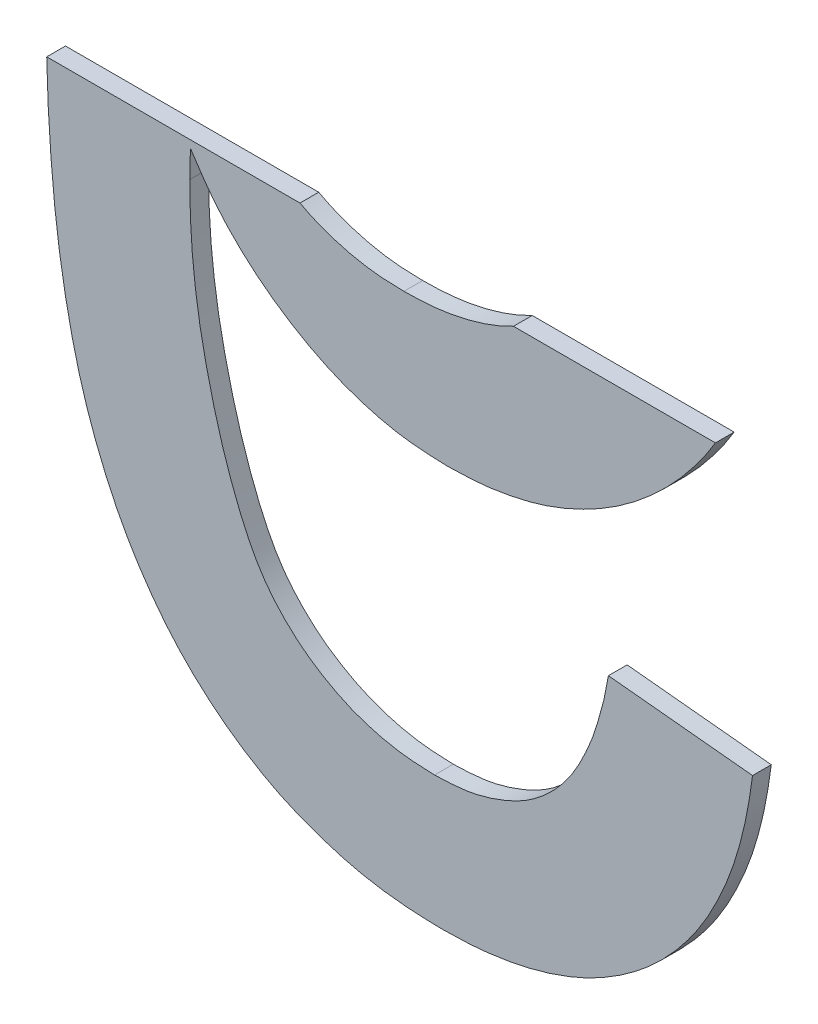
ISO-10303-21;
HEADER;
FILE_DESCRIPTION(('STEP AP214'),'2;1');
FILE_NAME('part.step','',(''),(''),'','','');
FILE_SCHEMA(('AUTOMOTIVE_DESIGN { 1 0 10303 214 1 1 1 1 }'));
ENDSEC;
DATA;
#1=APPLICATION_CONTEXT('core data for automotive mechanical design processes');
#2=APPLICATION_PROTOCOL_DEFINITION('international standard','automotive_design',2000,#1);
#3=PRODUCT_CONTEXT('',#1,'mechanical');
#4=PRODUCT('Part','Part','',(#3));
#5=PRODUCT_RELATED_PRODUCT_CATEGORY('part','',(#4));
#6=PRODUCT_DEFINITION_FORMATION('','',#4);
#7=PRODUCT_DEFINITION_CONTEXT('part definition',#1,'design');
#8=PRODUCT_DEFINITION('design','',#6,#7);
#9=PRODUCT_DEFINITION_SHAPE('','',#8);
#10=(LENGTH_UNIT() NAMED_UNIT(*) SI_UNIT(.MILLI.,.METRE.));
#11=(NAMED_UNIT(*) PLANE_ANGLE_UNIT() SI_UNIT($,.RADIAN.));
#12=(NAMED_UNIT(*) SI_UNIT($,.STERADIAN.) SOLID_ANGLE_UNIT());
#13=UNCERTAINTY_MEASURE_WITH_UNIT(LENGTH_MEASURE(1.E-05),#10,'distance_accuracy_value','');
#14=(GEOMETRIC_REPRESENTATION_CONTEXT(3) GLOBAL_UNCERTAINTY_ASSIGNED_CONTEXT((#13)) GLOBAL_UNIT_ASSIGNED_CONTEXT((#10,
#11,#12)) REPRESENTATION_CONTEXT('',''));
#15=CARTESIAN_POINT('',(0.,0.,0.));
#16=DIRECTION('',(0.,0.,1.));
#17=DIRECTION('',(1.,0.,0.));
#18=AXIS2_PLACEMENT_3D('',#15,#16,#17);
#19=CARTESIAN_POINT('',(-5.76923076923075,-0.697115384615386,0.5));
#20=CARTESIAN_POINT('',(-5.58381379302698,-0.978684532166005,0.5));
#21=CARTESIAN_POINT('',(-5.21327861184885,-1.54136912145183,0.5));
#22=CARTESIAN_POINT('',(-4.53066128737662,-2.2965599472643,0.5));
#23=CARTESIAN_POINT('',(-3.7497350785045,-2.96642446712882,0.5));
#24=CARTESIAN_POINT('',(-2.88235389720051,-3.54576110995613,0.5));
#25=CARTESIAN_POINT('',(-1.94993542457347,-4.02121118676336,0.5));
#26=CARTESIAN_POINT('',(-0.968700834074324,-4.36669246782933,0.5));
#27=CARTESIAN_POINT('',(0.0528912759195013,-4.58002261946033,0.5));
#28=CARTESIAN_POINT('',(0.748170492673242,-4.60350834340691,0.5));
#29=CARTESIAN_POINT('',(1.09975961538463,-4.61538461538462,0.5));
#30=B_SPLINE_CURVE_WITH_KNOTS('',3,(#19,#20,#21,#22,#23,#24,#25,#26,#27,#28,#29),.UNSPECIFIED.,
.F.,.F.,(4,1,1,1,1,1,1,1,4),(0.,0.12235507096646,0.244512985363297,0.368378430893787,
0.495352609667666,0.622624745145016,0.747620530593695,0.872376630710713,1.),.UNSPECIFIED.);
#31=DIRECTION('',(0.,0.,-1.));
#32=VECTOR('',#31,1.);
#33=SURFACE_OF_LINEAR_EXTRUSION('',#30,#32);
#34=CARTESIAN_POINT('',(-5.76923076923075,-0.697115384615386,0.));
#35=CARTESIAN_POINT('',(-5.58381379302698,-0.978684532166005,0.));
#36=CARTESIAN_POINT('',(-5.21327861184885,-1.54136912145183,0.));
#37=CARTESIAN_POINT('',(-4.53066128737662,-2.2965599472643,0.));
#38=CARTESIAN_POINT('',(-3.7497350785045,-2.96642446712882,0.));
#39=CARTESIAN_POINT('',(-2.88235389720051,-3.54576110995613,0.));
#40=CARTESIAN_POINT('',(-1.94993542457347,-4.02121118676336,0.));
#41=CARTESIAN_POINT('',(-0.968700834074324,-4.36669246782933,0.));
#42=CARTESIAN_POINT('',(0.0528912759195013,-4.58002261946033,0.));
#43=CARTESIAN_POINT('',(0.748170492673242,-4.60350834340691,0.));
#44=CARTESIAN_POINT('',(1.09975961538463,-4.61538461538462,0.));
#45=B_SPLINE_CURVE_WITH_KNOTS('',3,(#34,#35,#36,#37,#38,#39,#40,#41,#42,#43,#44),.UNSPECIFIED.,
.F.,.F.,(4,1,1,1,1,1,1,1,4),(0.,0.12235507096646,0.244512985363297,0.368378430893787,
0.495352609667666,0.622624745145016,0.747620530593695,0.872376630710713,1.),.UNSPECIFIED.);
#46=CARTESIAN_POINT('',(-5.76923076923075,-0.697115384615386,0.));
#47=VERTEX_POINT('',#46);
#48=CARTESIAN_POINT('',(1.09975961538463,-4.61538461538462,0.));
#49=VERTEX_POINT('',#48);
#50=EDGE_CURVE('E133',#47,#49,#45,.T.);
#51=ORIENTED_EDGE('',*,*,#50,.T.);
#52=DIRECTION('',(0.,0.,-1.));
#53=VECTOR('',#52,1.);
#54=CARTESIAN_POINT('',(1.09975961538463,-4.61538461538462,0.5));
#55=LINE('',#54,#53);
#56=CARTESIAN_POINT('',(1.09975961538463,-4.61538461538462,0.5));
#57=VERTEX_POINT('',#56);
#58=EDGE_CURVE('E160',#57,#49,#55,.T.);
#59=ORIENTED_EDGE('',*,*,#58,.F.);
#60=CARTESIAN_POINT('',(-5.76923076923075,-0.697115384615386,0.5));
#61=VERTEX_POINT('',#60);
#62=EDGE_CURVE('E285',#61,#57,#30,.T.);
#63=ORIENTED_EDGE('',*,*,#62,.F.);
#64=DIRECTION('',(0.,0.,-1.));
#65=VECTOR('',#64,1.);
#66=CARTESIAN_POINT('',(-5.76923076923075,-0.697115384615386,0.5));
#67=LINE('',#66,#65);
#68=EDGE_CURVE('E575',#61,#47,#67,.T.);
#69=ORIENTED_EDGE('',*,*,#68,.T.);
#70=EDGE_LOOP('',(#51,#59,#63,#69));
#71=FACE_BOUND('',#70,.T.);
#72=ADVANCED_FACE('F39',(#71),#33,.F.);
#73=CARTESIAN_POINT('',(-5.7872596153846,-1.43028846153846,0.5));
#74=CARTESIAN_POINT('',(-5.78543907945261,-1.32812063639986,0.5));
#75=CARTESIAN_POINT('',(-5.78108355384899,-1.08369009787678,0.5));
#76=CARTESIAN_POINT('',(-5.77359135554209,-0.839334488163484,0.5));
#77=CARTESIAN_POINT('',(-5.76923076923075,-0.697115384615386,0.5));
#78=B_SPLINE_CURVE_WITH_KNOTS('',3,(#73,#74,#75,#76,#77),.UNSPECIFIED.,.F.,.F.,(4,1,4),(0.,
0.417983062819945,1.),.UNSPECIFIED.);
#79=DIRECTION('',(0.,0.,-1.));
#80=VECTOR('',#79,1.);
#81=SURFACE_OF_LINEAR_EXTRUSION('',#78,#80);
#82=CARTESIAN_POINT('',(-5.7872596153846,-1.43028846153846,0.));
#83=CARTESIAN_POINT('',(-5.78543907945261,-1.32812063639986,0.));
#84=CARTESIAN_POINT('',(-5.78108355384899,-1.08369009787678,0.));
#85=CARTESIAN_POINT('',(-5.77359135554209,-0.839334488163484,0.));
#86=CARTESIAN_POINT('',(-5.76923076923075,-0.697115384615386,0.));
#87=B_SPLINE_CURVE_WITH_KNOTS('',3,(#82,#83,#84,#85,#86),.UNSPECIFIED.,.F.,.F.,(4,1,4),(0.,
0.417983062819945,1.),.UNSPECIFIED.);
#88=CARTESIAN_POINT('',(-5.7872596153846,-1.43028846153846,0.));
#89=VERTEX_POINT('',#88);
#90=EDGE_CURVE('E195',#89,#47,#87,.T.);
#91=ORIENTED_EDGE('',*,*,#90,.T.);
#92=ORIENTED_EDGE('',*,*,#68,.F.);
#93=CARTESIAN_POINT('',(-5.7872596153846,-1.43028846153846,0.5));
#94=VERTEX_POINT('',#93);
#95=EDGE_CURVE('E288',#94,#61,#78,.T.);
#96=ORIENTED_EDGE('',*,*,#95,.F.);
#97=DIRECTION('',(0.,0.,-1.));
#98=VECTOR('',#97,1.);
#99=CARTESIAN_POINT('',(-5.7872596153846,-1.43028846153846,0.5));
#100=LINE('',#99,#98);
#101=EDGE_CURVE('E578',#94,#89,#100,.T.);
#102=ORIENTED_EDGE('',*,*,#101,.T.);
#103=EDGE_LOOP('',(#91,#92,#96,#102));
#104=FACE_BOUND('',#103,.T.);
#105=ADVANCED_FACE('F308',(#104),#81,.F.);
#106=CARTESIAN_POINT('',(0.745192307692323,-11.9230769230769,0.5));
#107=CARTESIAN_POINT('',(0.486131843449952,-11.9137479208925,0.5));
#108=CARTESIAN_POINT('',(-0.023739311296695,-11.8953869983553,0.5));
#109=CARTESIAN_POINT('',(-0.767148335472325,-11.7530516571858,0.5));
#110=CARTESIAN_POINT('',(-1.47411876752795,-11.5250334138168,0.5));
#111=CARTESIAN_POINT('',(-2.13234421598042,-11.1978749877077,0.5));
#112=CARTESIAN_POINT('',(-2.73942907415517,-10.7997323127317,0.5));
#113=CARTESIAN_POINT('',(-3.26969723061817,-10.3266586152699,0.5));
#114=CARTESIAN_POINT('',(-3.73022940699366,-9.79902859292467,0.5));
#115=CARTESIAN_POINT('',(-4.10846938257053,-9.19109757118498,0.5));
#116=CARTESIAN_POINT('',(-4.43130742011076,-8.4967383071236,0.5));
#117=CARTESIAN_POINT('',(-4.73634641888079,-7.70711998570168,0.5));
#118=CARTESIAN_POINT('',(-5.02490826013239,-6.80863885863995,0.5));
#119=CARTESIAN_POINT('',(-5.28136505449538,-5.81275474275421,0.5));
#120=CARTESIAN_POINT('',(-5.51100955926097,-4.75582556366904,0.5));
#121=CARTESIAN_POINT('',(-5.67217185368737,-3.66180020661924,0.5));
#122=CARTESIAN_POINT('',(-5.77132873386463,-2.5519482184744,0.5));
#123=CARTESIAN_POINT('',(-5.7819362671156,-1.8050941819883,0.5));
#124=CARTESIAN_POINT('',(-5.7872596153846,-1.43028846153846,0.5));
#125=B_SPLINE_CURVE_WITH_KNOTS('',3,(#106,#107,#108,#109,#110,#111,#112,#113,#114,#115,#116,
#117,#118,#119,#120,#121,#122,#123,#124),.UNSPECIFIED.,.F.,.F.,(4,1,1,1,1,1,1,1,1,1,1,1,1,1,1,1,
4),(0.,0.0561121469696214,0.110437404080105,0.163431413703198,0.216631308793094,
0.269250545502901,0.320302612616842,0.370170605167896,0.420516318229052,0.474888393265587,
0.535919197587643,0.603880391457304,0.679276566607707,0.758720144956108,0.838169654364157,
0.918786086271869,1.),.UNSPECIFIED.);
#126=DIRECTION('',(0.,0.,-1.));
#127=VECTOR('',#126,1.);
#128=SURFACE_OF_LINEAR_EXTRUSION('',#125,#127);
#129=CARTESIAN_POINT('',(0.745192307692323,-11.9230769230769,0.));
#130=CARTESIAN_POINT('',(0.486131843449952,-11.9137479208925,0.));
#131=CARTESIAN_POINT('',(-0.023739311296695,-11.8953869983553,0.));
#132=CARTESIAN_POINT('',(-0.767148335472325,-11.7530516571858,0.));
#133=CARTESIAN_POINT('',(-1.47411876752795,-11.5250334138168,0.));
#134=CARTESIAN_POINT('',(-2.13234421598042,-11.1978749877077,0.));
#135=CARTESIAN_POINT('',(-2.73942907415517,-10.7997323127317,0.));
#136=CARTESIAN_POINT('',(-3.26969723061817,-10.3266586152699,0.));
#137=CARTESIAN_POINT('',(-3.73022940699366,-9.79902859292467,0.));
#138=CARTESIAN_POINT('',(-4.10846938257053,-9.19109757118498,0.));
#139=CARTESIAN_POINT('',(-4.43130742011076,-8.4967383071236,0.));
#140=CARTESIAN_POINT('',(-4.73634641888079,-7.70711998570168,0.));
#141=CARTESIAN_POINT('',(-5.02490826013239,-6.80863885863995,0.));
#142=CARTESIAN_POINT('',(-5.28136505449538,-5.81275474275421,0.));
#143=CARTESIAN_POINT('',(-5.51100955926097,-4.75582556366904,0.));
#144=CARTESIAN_POINT('',(-5.67217185368737,-3.66180020661924,0.));
#145=CARTESIAN_POINT('',(-5.77132873386463,-2.5519482184744,0.));
#146=CARTESIAN_POINT('',(-5.7819362671156,-1.8050941819883,0.));
#147=CARTESIAN_POINT('',(-5.7872596153846,-1.43028846153846,0.));
#148=B_SPLINE_CURVE_WITH_KNOTS('',3,(#129,#130,#131,#132,#133,#134,#135,#136,#137,#138,#139,
#140,#141,#142,#143,#144,#145,#146,#147),.UNSPECIFIED.,.F.,.F.,(4,1,1,1,1,1,1,1,1,1,1,1,1,1,1,1,
4),(0.,0.0561121469696214,0.110437404080105,0.163431413703198,0.216631308793094,
0.269250545502901,0.320302612616842,0.370170605167896,0.420516318229052,0.474888393265587,
0.535919197587643,0.603880391457304,0.679276566607707,0.758720144956108,0.838169654364157,
0.918786086271869,1.),.UNSPECIFIED.);
#149=CARTESIAN_POINT('',(0.745192307692324,-11.9230769230769,0.));
#150=VERTEX_POINT('',#149);
#151=EDGE_CURVE('E184',#150,#89,#148,.T.);
#152=ORIENTED_EDGE('',*,*,#151,.T.);
#153=ORIENTED_EDGE('',*,*,#101,.F.);
#154=CARTESIAN_POINT('',(0.745192307692324,-11.9230769230769,0.5));
#155=VERTEX_POINT('',#154);
#156=EDGE_CURVE('E300',#155,#94,#125,.T.);
#157=ORIENTED_EDGE('',*,*,#156,.F.);
#158=DIRECTION('',(0.,0.,-1.));
#159=VECTOR('',#158,1.);
#160=CARTESIAN_POINT('',(0.745192307692324,-11.9230769230769,0.5));
#161=LINE('',#160,#159);
#162=EDGE_CURVE('E576',#155,#150,#161,.T.);
#163=ORIENTED_EDGE('',*,*,#162,.T.);
#164=EDGE_LOOP('',(#152,#153,#157,#163));
#165=FACE_BOUND('',#164,.T.);
#166=ADVANCED_FACE('F309',(#165),#128,.F.);
#167=CARTESIAN_POINT('',(5.3846153846154,-7.30769230769231,0.5));
#168=CARTESIAN_POINT('',(5.34984385892072,-7.50475409295837,0.5));
#169=CARTESIAN_POINT('',(5.28262755072809,-7.88569123698083,0.5));
#170=CARTESIAN_POINT('',(5.13094152747863,-8.42859194661917,0.5));
#171=CARTESIAN_POINT('',(4.97709469121427,-8.93479428414117,0.5));
#172=CARTESIAN_POINT('',(4.77849915191939,-9.39302127303128,0.5));
#173=CARTESIAN_POINT('',(4.57167637521298,-9.81571962134782,0.5));
#174=CARTESIAN_POINT('',(4.3374552557641,-10.1986535679597,0.5));
#175=CARTESIAN_POINT('',(4.07166276021052,-10.5341320041231,0.5));
#176=CARTESIAN_POINT('',(3.69632885357006,-10.9272529401627,0.5));
#177=CARTESIAN_POINT('',(3.16378468823838,-11.3374813077678,0.5));
#178=CARTESIAN_POINT('',(2.42560630063418,-11.6697822763518,0.5));
#179=CARTESIAN_POINT('',(1.61354073541334,-11.8932116708321,0.5));
#180=CARTESIAN_POINT('',(1.04125812096131,-11.9128942822014,0.5));
#181=CARTESIAN_POINT('',(0.745192307692324,-11.9230769230769,0.5));
#182=B_SPLINE_CURVE_WITH_KNOTS('',3,(#167,#168,#169,#170,#171,#172,#173,#174,#175,#176,#177,
#178,#179,#180,#181),.UNSPECIFIED.,.F.,.F.,(4,1,1,1,1,1,1,1,1,1,1,1,4),(0.,0.0828763755690714,
0.16020706284372,0.233459386692897,0.301920909441199,0.366895738384487,0.42841034775951,
0.487536786371614,0.543906075892287,0.65349798480259,0.763438398464128,0.877616755815664,1.),.UNSPECIFIED.);
#183=DIRECTION('',(0.,0.,-1.));
#184=VECTOR('',#183,1.);
#185=SURFACE_OF_LINEAR_EXTRUSION('',#182,#184);
#186=CARTESIAN_POINT('',(5.3846153846154,-7.30769230769231,0.));
#187=CARTESIAN_POINT('',(5.34984385892072,-7.50475409295837,0.));
#188=CARTESIAN_POINT('',(5.28262755072809,-7.88569123698083,0.));
#189=CARTESIAN_POINT('',(5.13094152747863,-8.42859194661917,0.));
#190=CARTESIAN_POINT('',(4.97709469121427,-8.93479428414117,0.));
#191=CARTESIAN_POINT('',(4.77849915191939,-9.39302127303128,0.));
#192=CARTESIAN_POINT('',(4.57167637521298,-9.81571962134782,0.));
#193=CARTESIAN_POINT('',(4.3374552557641,-10.1986535679597,0.));
#194=CARTESIAN_POINT('',(4.07166276021052,-10.5341320041231,0.));
#195=CARTESIAN_POINT('',(3.69632885357006,-10.9272529401627,0.));
#196=CARTESIAN_POINT('',(3.16378468823838,-11.3374813077678,0.));
#197=CARTESIAN_POINT('',(2.42560630063418,-11.6697822763518,0.));
#198=CARTESIAN_POINT('',(1.61354073541334,-11.8932116708321,0.));
#199=CARTESIAN_POINT('',(1.04125812096131,-11.9128942822014,0.));
#200=CARTESIAN_POINT('',(0.745192307692324,-11.9230769230769,0.));
#201=B_SPLINE_CURVE_WITH_KNOTS('',3,(#186,#187,#188,#189,#190,#191,#192,#193,#194,#195,#196,
#197,#198,#199,#200),.UNSPECIFIED.,.F.,.F.,(4,1,1,1,1,1,1,1,1,1,1,1,4),(0.,0.0828763755690714,
0.16020706284372,0.233459386692897,0.301920909441199,0.366895738384487,0.42841034775951,
0.487536786371614,0.543906075892287,0.65349798480259,0.763438398464128,0.877616755815664,1.),.UNSPECIFIED.);
#202=CARTESIAN_POINT('',(5.3846153846154,-7.30769230769231,0.));
#203=VERTEX_POINT('',#202);
#204=EDGE_CURVE('E168',#203,#150,#201,.T.);
#205=ORIENTED_EDGE('',*,*,#204,.T.);
#206=ORIENTED_EDGE('',*,*,#162,.F.);
#207=CARTESIAN_POINT('',(5.3846153846154,-7.30769230769231,0.5));
#208=VERTEX_POINT('',#207);
#209=EDGE_CURVE('E318',#208,#155,#182,.T.);
#210=ORIENTED_EDGE('',*,*,#209,.F.);
#211=DIRECTION('',(0.,0.,-1.));
#212=VECTOR('',#211,1.);
#213=CARTESIAN_POINT('',(5.3846153846154,-7.30769230769231,0.5));
#214=LINE('',#213,#212);
#215=EDGE_CURVE('E582',#208,#203,#214,.T.);
#216=ORIENTED_EDGE('',*,*,#215,.T.);
#217=EDGE_LOOP('',(#205,#206,#210,#216));
#218=FACE_BOUND('',#217,.T.);
#219=ADVANCED_FACE('F313',(#218),#185,.F.);
#220=CARTESIAN_POINT('',(9.23076923076925,-7.69230769230769,0.5));
#221=DIRECTION('',(-0.099503719020999,-0.995037190209989,0.));
#222=DIRECTION('',(0.995037190209989,-0.0995037190209991,0.));
#223=AXIS2_PLACEMENT_3D('',#220,#221,#222);
#224=PLANE('',#223);
#225=DIRECTION('',(-0.995037190209989,0.099503719020999,0.));
#226=VECTOR('',#225,1.);
#227=CARTESIAN_POINT('',(9.23076923076925,-7.69230769230769,0.));
#228=LINE('',#227,#226);
#229=CARTESIAN_POINT('',(9.23076923076925,-7.69230769230769,0.));
#230=VERTEX_POINT('',#229);
#231=EDGE_CURVE('E164',#230,#203,#228,.T.);
#232=ORIENTED_EDGE('',*,*,#231,.T.);
#233=ORIENTED_EDGE('',*,*,#215,.F.);
#234=DIRECTION('',(-0.995037190209989,0.099503719020999,0.));
#235=VECTOR('',#234,1.);
#236=CARTESIAN_POINT('',(9.23076923076925,-7.69230769230769,0.5));
#237=LINE('',#236,#235);
#238=CARTESIAN_POINT('',(9.23076923076925,-7.69230769230769,0.5));
#239=VERTEX_POINT('',#238);
#240=EDGE_CURVE('E322',#239,#208,#237,.T.);
#241=ORIENTED_EDGE('',*,*,#240,.F.);
#242=DIRECTION('',(0.,0.,-1.));
#243=VECTOR('',#242,1.);
#244=CARTESIAN_POINT('',(9.23076923076925,-7.69230769230769,0.5));
#245=LINE('',#244,#243);
#246=EDGE_CURVE('E49',#239,#230,#245,.T.);
#247=ORIENTED_EDGE('',*,*,#246,.T.);
#248=EDGE_LOOP('',(#232,#233,#241,#247));
#249=FACE_BOUND('',#248,.T.);
#250=ADVANCED_FACE('F316',(#249),#224,.F.);
#251=CARTESIAN_POINT('',(0.943509615384633,-15.3846153846154,0.5));
#252=CARTESIAN_POINT('',(1.22628026497043,-15.3797262561442,0.5));
#253=CARTESIAN_POINT('',(1.77952219090649,-15.3701606564064,0.5));
#254=CARTESIAN_POINT('',(2.58719848692074,-15.2695777028622,0.5));
#255=CARTESIAN_POINT('',(3.35661737490023,-15.1166588313252,0.5));
#256=CARTESIAN_POINT('',(4.08553958863802,-14.8909143623273,0.5));
#257=CARTESIAN_POINT('',(4.77942406383352,-14.6130289830505,0.5));
#258=CARTESIAN_POINT('',(5.42642753427259,-14.2579072723362,0.5));
#259=CARTESIAN_POINT('',(6.03804809271238,-13.848203062894,0.5));
#260=CARTESIAN_POINT('',(6.60674021401743,-13.3756543228348,0.5));
#261=CARTESIAN_POINT('',(7.12584529819792,-12.841996372828,0.5));
#262=CARTESIAN_POINT('',(7.59553619193628,-12.2603814173487,0.5));
#263=CARTESIAN_POINT('',(8.00731672421825,-11.6232765490402,0.5));
#264=CARTESIAN_POINT('',(8.35903190597762,-10.9344379490729,0.5));
#265=CARTESIAN_POINT('',(8.67056996655947,-10.1996608491813,0.5));
#266=CARTESIAN_POINT('',(8.91209668696316,-9.40909234193086,0.5));
#267=CARTESIAN_POINT('',(9.10831391588154,-8.57002381485291,0.5));
#268=CARTESIAN_POINT('',(9.1892916439912,-7.98960427492436,0.5));
#269=CARTESIAN_POINT('',(9.23076923076925,-7.69230769230769,0.5));
#270=B_SPLINE_CURVE_WITH_KNOTS('',3,(#251,#252,#253,#254,#255,#256,#257,#258,#259,#260,#261,
#262,#263,#264,#265,#266,#267,#268,#269),.UNSPECIFIED.,.F.,.F.,(4,1,1,1,1,1,1,1,1,1,1,1,1,1,1,1,
4),(0.,0.0676247856478378,0.132308168148376,0.194442718532601,0.255089752738009,
0.314635829043243,0.372971663301315,0.4313311216833,0.490552229969122,0.549528437155075,
0.609188219154995,0.669147607919159,0.730672799187913,0.794051994363794,0.859844647711371,
0.928211053549348,1.),.UNSPECIFIED.);
#271=DIRECTION('',(0.,0.,-1.));
#272=VECTOR('',#271,1.);
#273=SURFACE_OF_LINEAR_EXTRUSION('',#270,#272);
#274=CARTESIAN_POINT('',(0.943509615384633,-15.3846153846154,0.));
#275=CARTESIAN_POINT('',(1.22628026497043,-15.3797262561442,0.));
#276=CARTESIAN_POINT('',(1.77952219090649,-15.3701606564064,0.));
#277=CARTESIAN_POINT('',(2.58719848692074,-15.2695777028622,0.));
#278=CARTESIAN_POINT('',(3.35661737490023,-15.1166588313252,0.));
#279=CARTESIAN_POINT('',(4.08553958863802,-14.8909143623273,0.));
#280=CARTESIAN_POINT('',(4.77942406383352,-14.6130289830505,0.));
#281=CARTESIAN_POINT('',(5.42642753427259,-14.2579072723362,0.));
#282=CARTESIAN_POINT('',(6.03804809271238,-13.848203062894,0.));
#283=CARTESIAN_POINT('',(6.60674021401743,-13.3756543228348,0.));
#284=CARTESIAN_POINT('',(7.12584529819792,-12.841996372828,0.));
#285=CARTESIAN_POINT('',(7.59553619193628,-12.2603814173487,0.));
#286=CARTESIAN_POINT('',(8.00731672421825,-11.6232765490402,0.));
#287=CARTESIAN_POINT('',(8.35903190597762,-10.9344379490729,0.));
#288=CARTESIAN_POINT('',(8.67056996655947,-10.1996608491813,0.));
#289=CARTESIAN_POINT('',(8.91209668696316,-9.40909234193086,0.));
#290=CARTESIAN_POINT('',(9.10831391588154,-8.57002381485291,0.));
#291=CARTESIAN_POINT('',(9.1892916439912,-7.98960427492436,0.));
#292=CARTESIAN_POINT('',(9.23076923076925,-7.69230769230769,0.));
#293=B_SPLINE_CURVE_WITH_KNOTS('',3,(#274,#275,#276,#277,#278,#279,#280,#281,#282,#283,#284,
#285,#286,#287,#288,#289,#290,#291,#292),.UNSPECIFIED.,.F.,.F.,(4,1,1,1,1,1,1,1,1,1,1,1,1,1,1,1,
4),(0.,0.0676247856478378,0.132308168148376,0.194442718532601,0.255089752738009,
0.314635829043243,0.372971663301315,0.4313311216833,0.490552229969122,0.549528437155075,
0.609188219154995,0.669147607919159,0.730672799187913,0.794051994363794,0.859844647711371,
0.928211053549348,1.),.UNSPECIFIED.);
#294=CARTESIAN_POINT('',(0.943509615384633,-15.3846153846154,0.));
#295=VERTEX_POINT('',#294);
#296=EDGE_CURVE('E153',#295,#230,#293,.T.);
#297=ORIENTED_EDGE('',*,*,#296,.T.);
#298=ORIENTED_EDGE('',*,*,#246,.F.);
#299=CARTESIAN_POINT('',(0.943509615384633,-15.3846153846154,0.5));
#300=VERTEX_POINT('',#299);
#301=EDGE_CURVE('E146',#300,#239,#270,.T.);
#302=ORIENTED_EDGE('',*,*,#301,.F.);
#303=DIRECTION('',(0.,0.,-1.));
#304=VECTOR('',#303,1.);
#305=CARTESIAN_POINT('',(0.943509615384633,-15.3846153846154,0.5));
#306=LINE('',#305,#304);
#307=EDGE_CURVE('E143',#300,#295,#306,.T.);
#308=ORIENTED_EDGE('',*,*,#307,.T.);
#309=EDGE_LOOP('',(#297,#298,#302,#308));
#310=FACE_BOUND('',#309,.T.);
#311=ADVANCED_FACE('F41',(#310),#273,.F.);
#312=CARTESIAN_POINT('',(5.76923076923079,4.83774038461538,0.5));
#313=CARTESIAN_POINT('',(5.76559753253748,4.62107828632409,0.5));
#314=CARTESIAN_POINT('',(5.75847416780461,4.19628813908102,0.5));
#315=CARTESIAN_POINT('',(5.67364275234917,3.57634561138139,0.5));
#316=CARTESIAN_POINT('',(5.56049023234097,2.98466710580137,0.5));
#317=CARTESIAN_POINT('',(5.38010372830871,2.42729215161989,0.5));
#318=CARTESIAN_POINT('',(5.16279039895238,1.8961287409815,0.5));
#319=CARTESIAN_POINT('',(4.88034990033308,1.40337584742006,0.5));
#320=CARTESIAN_POINT('',(4.56234879705193,0.934299189069977,0.5));
#321=CARTESIAN_POINT('',(4.18974893379179,0.504612898451396,0.5));
#322=CARTESIAN_POINT('',(3.77783898339826,0.114812101552504,0.5));
#323=CARTESIAN_POINT('',(3.32794970507642,-0.224941250153386,0.5));
#324=CARTESIAN_POINT('',(2.845763670524,-0.515776018395924,0.5));
#325=CARTESIAN_POINT('',(2.32680117156969,-0.749856785619088,0.5));
#326=CARTESIAN_POINT('',(1.77417436897692,-0.930133405348942,0.5));
#327=CARTESIAN_POINT('',(1.18911678898298,-1.06285336343452,0.5));
#328=CARTESIAN_POINT('',(0.569085331114844,-1.14190466031389,0.5));
#329=CARTESIAN_POINT('',(0.144461754934995,-1.14981269841211,0.5));
#330=CARTESIAN_POINT('',(-0.0721153846153684,-1.15384615384615,0.5));
#331=B_SPLINE_CURVE_WITH_KNOTS('',3,(#312,#313,#314,#315,#316,#317,#318,#319,#320,#321,#322,
#323,#324,#325,#326,#327,#328,#329,#330),.UNSPECIFIED.,.F.,.F.,(4,1,1,1,1,1,1,1,1,1,1,1,1,1,1,1,
4),(0.,0.0688877507567127,0.135062099084096,0.198816097167165,0.260302455571233,
0.321151150591035,0.381081487065822,0.440665068442198,0.501229320566076,0.561652530159204,
0.620804960677879,0.680272507705816,0.740463287087672,0.801538582632135,0.864937900915904,
0.931112249243287,1.),.UNSPECIFIED.);
#332=DIRECTION('',(0.,0.,-1.));
#333=VECTOR('',#332,1.);
#334=SURFACE_OF_LINEAR_EXTRUSION('',#331,#333);
#335=CARTESIAN_POINT('',(2.85167830923094,-0.5,0.5));
#336=VERTEX_POINT('',#335);
#337=CARTESIAN_POINT('',(-0.0721153846153684,-1.15384615384615,0.5));
#338=VERTEX_POINT('',#337);
#339=EDGE_CURVE('E170',#336,#338,#331,.T.);
#340=ORIENTED_EDGE('',*,*,#339,.F.);
#341=DIRECTION('',(0.,0.,-1.));
#342=VECTOR('',#341,1.);
#343=CARTESIAN_POINT('',(2.85167830923094,-0.5,0.5));
#344=LINE('',#343,#342);
#345=CARTESIAN_POINT('',(2.85167830923094,-0.5,0.));
#346=VERTEX_POINT('',#345);
#347=EDGE_CURVE('E11',#336,#346,#344,.T.);
#348=ORIENTED_EDGE('',*,*,#347,.T.);
#349=CARTESIAN_POINT('',(5.76923076923079,4.83774038461538,0.));
#350=CARTESIAN_POINT('',(5.76559753253748,4.62107828632409,0.));
#351=CARTESIAN_POINT('',(5.75847416780461,4.19628813908102,0.));
#352=CARTESIAN_POINT('',(5.67364275234917,3.57634561138139,0.));
#353=CARTESIAN_POINT('',(5.56049023234097,2.98466710580137,0.));
#354=CARTESIAN_POINT('',(5.38010372830871,2.42729215161989,0.));
#355=CARTESIAN_POINT('',(5.16279039895238,1.8961287409815,0.));
#356=CARTESIAN_POINT('',(4.88034990033308,1.40337584742006,0.));
#357=CARTESIAN_POINT('',(4.56234879705193,0.934299189069977,0.));
#358=CARTESIAN_POINT('',(4.18974893379179,0.504612898451396,0.));
#359=CARTESIAN_POINT('',(3.77783898339826,0.114812101552504,0.));
#360=CARTESIAN_POINT('',(3.32794970507642,-0.224941250153386,0.));
#361=CARTESIAN_POINT('',(2.845763670524,-0.515776018395924,0.));
#362=CARTESIAN_POINT('',(2.32680117156969,-0.749856785619088,0.));
#363=CARTESIAN_POINT('',(1.77417436897692,-0.930133405348942,0.));
#364=CARTESIAN_POINT('',(1.18911678898298,-1.06285336343452,0.));
#365=CARTESIAN_POINT('',(0.569085331114844,-1.14190466031389,0.));
#366=CARTESIAN_POINT('',(0.144461754934995,-1.14981269841211,0.));
#367=CARTESIAN_POINT('',(-0.0721153846153684,-1.15384615384615,0.));
#368=B_SPLINE_CURVE_WITH_KNOTS('',3,(#349,#350,#351,#352,#353,#354,#355,#356,#357,#358,#359,
#360,#361,#362,#363,#364,#365,#366,#367),.UNSPECIFIED.,.F.,.F.,(4,1,1,1,1,1,1,1,1,1,1,1,1,1,1,1,
4),(0.,0.0688877507567127,0.135062099084096,0.198816097167165,0.260302455571233,
0.321151150591035,0.381081487065822,0.440665068442198,0.501229320566076,0.561652530159204,
0.620804960677879,0.680272507705816,0.740463287087672,0.801538582632135,0.864937900915904,
0.931112249243287,1.),.UNSPECIFIED.);
#369=CARTESIAN_POINT('',(-0.0721153846153684,-1.15384615384615,0.));
#370=VERTEX_POINT('',#369);
#371=EDGE_CURVE('E249',#346,#370,#368,.T.);
#372=ORIENTED_EDGE('',*,*,#371,.T.);
#373=DIRECTION('',(0.,0.,-1.));
#374=VECTOR('',#373,1.);
#375=CARTESIAN_POINT('',(-0.0721153846153684,-1.15384615384615,0.5));
#376=LINE('',#375,#374);
#377=EDGE_CURVE('E161',#338,#370,#376,.T.);
#378=ORIENTED_EDGE('',*,*,#377,.F.);
#379=EDGE_LOOP('',(#340,#348,#372,#378));
#380=FACE_BOUND('',#379,.T.);
#381=ADVANCED_FACE('F261',(#380),#334,.F.);
#382=CARTESIAN_POINT('',(-0.0721153846153684,-1.15384615384615,0.5));
#383=CARTESIAN_POINT('',(-0.274685081191588,-1.14977328158864,0.5));
#384=CARTESIAN_POINT('',(-0.673387563703523,-1.14175695778765,0.5));
#385=CARTESIAN_POINT('',(-1.25744480672721,-1.06236867003036,0.5));
#386=CARTESIAN_POINT('',(-1.81240898425206,-0.929402575974411,0.5));
#387=CARTESIAN_POINT('',(-2.34077180885591,-0.748629574870465,0.5));
#388=CARTESIAN_POINT('',(-2.84167690098609,-0.514629744057609,0.5));
#389=CARTESIAN_POINT('',(-3.31175597519857,-0.221483770104905,0.5));
#390=CARTESIAN_POINT('',(-3.76009599169457,0.114387101471254,0.5));
#391=CARTESIAN_POINT('',(-4.17355440197439,0.506835821336498,0.5));
#392=CARTESIAN_POINT('',(-4.55144025189374,0.941353294188342,0.5));
#393=CARTESIAN_POINT('',(-4.87824124380278,1.4222321795736,0.5));
#394=CARTESIAN_POINT('',(-5.15731176174261,1.94073957222652,0.5));
#395=CARTESIAN_POINT('',(-5.3769686596106,2.50302151604002,0.5));
#396=CARTESIAN_POINT('',(-5.55290341998866,3.10215532273428,0.5));
#397=CARTESIAN_POINT('',(-5.67677317981351,3.74193419395728,0.5));
#398=CARTESIAN_POINT('',(-5.75789330980674,4.42099239122179,0.5));
#399=CARTESIAN_POINT('',(-5.76539445965032,4.88757685002568,0.5));
#400=CARTESIAN_POINT('',(-5.76923076923075,5.12620192307692,0.5));
#401=B_SPLINE_CURVE_WITH_KNOTS('',3,(#382,#383,#384,#385,#386,#387,#388,#389,#390,#391,#392,
#393,#394,#395,#396,#397,#398,#399,#400),.UNSPECIFIED.,.F.,.F.,(4,1,1,1,1,1,1,1,1,1,1,1,1,1,1,1,
4),(0.,0.0635627947613132,0.125105800596373,0.184590363575065,0.242460879472413,
0.300129463155241,0.357722568856944,0.416079614598885,0.475690352064488,0.536327121957145,
0.596502370765227,0.657832970047864,0.72077370375448,0.785645050612482,0.853597783500185,
0.925125582415045,1.),.UNSPECIFIED.);
#402=DIRECTION('',(0.,0.,-1.));
#403=VECTOR('',#402,1.);
#404=SURFACE_OF_LINEAR_EXTRUSION('',#401,#403);
#405=CARTESIAN_POINT('',(-0.0721153846153684,-1.15384615384615,0.));
#406=CARTESIAN_POINT('',(-0.274685081191588,-1.14977328158864,0.));
#407=CARTESIAN_POINT('',(-0.673387563703523,-1.14175695778765,0.));
#408=CARTESIAN_POINT('',(-1.25744480672721,-1.06236867003036,0.));
#409=CARTESIAN_POINT('',(-1.81240898425206,-0.929402575974411,0.));
#410=CARTESIAN_POINT('',(-2.34077180885591,-0.748629574870465,0.));
#411=CARTESIAN_POINT('',(-2.84167690098609,-0.514629744057609,0.));
#412=CARTESIAN_POINT('',(-3.31175597519857,-0.221483770104905,0.));
#413=CARTESIAN_POINT('',(-3.76009599169457,0.114387101471254,0.));
#414=CARTESIAN_POINT('',(-4.17355440197439,0.506835821336498,0.));
#415=CARTESIAN_POINT('',(-4.55144025189374,0.941353294188342,0.));
#416=CARTESIAN_POINT('',(-4.87824124380278,1.4222321795736,0.));
#417=CARTESIAN_POINT('',(-5.15731176174261,1.94073957222652,0.));
#418=CARTESIAN_POINT('',(-5.3769686596106,2.50302151604002,0.));
#419=CARTESIAN_POINT('',(-5.55290341998866,3.10215532273428,0.));
#420=CARTESIAN_POINT('',(-5.67677317981351,3.74193419395728,0.));
#421=CARTESIAN_POINT('',(-5.75789330980674,4.42099239122179,0.));
#422=CARTESIAN_POINT('',(-5.76539445965032,4.88757685002568,0.));
#423=CARTESIAN_POINT('',(-5.76923076923075,5.12620192307692,0.));
#424=B_SPLINE_CURVE_WITH_KNOTS('',3,(#405,#406,#407,#408,#409,#410,#411,#412,#413,#414,#415,
#416,#417,#418,#419,#420,#421,#422,#423),.UNSPECIFIED.,.F.,.F.,(4,1,1,1,1,1,1,1,1,1,1,1,1,1,1,1,
4),(0.,0.0635627947613132,0.125105800596373,0.184590363575065,0.242460879472413,
0.300129463155241,0.357722568856944,0.416079614598885,0.475690352064488,0.536327121957145,
0.596502370765227,0.657832970047864,0.72077370375448,0.785645050612482,0.853597783500185,
0.925125582415045,1.),.UNSPECIFIED.);
#425=CARTESIAN_POINT('',(-2.8453718266167,-0.500000002075057,0.));
#426=VERTEX_POINT('',#425);
#427=EDGE_CURVE('E232',#370,#426,#424,.T.);
#428=ORIENTED_EDGE('',*,*,#427,.T.);
#429=DIRECTION('',(0.,0.,-1.));
#430=VECTOR('',#429,1.);
#431=CARTESIAN_POINT('',(-2.8453718304188,-0.500000000000299,0.5));
#432=LINE('',#431,#430);
#433=CARTESIAN_POINT('',(-2.8453718304188,-0.500000000000299,0.5));
#434=VERTEX_POINT('',#433);
#435=EDGE_CURVE('E69',#426,#434,#432,.F.);
#436=ORIENTED_EDGE('',*,*,#435,.T.);
#437=EDGE_CURVE('E241',#338,#434,#401,.T.);
#438=ORIENTED_EDGE('',*,*,#437,.F.);
#439=ORIENTED_EDGE('',*,*,#377,.T.);
#440=EDGE_LOOP('',(#428,#436,#438,#439));
#441=FACE_BOUND('',#440,.T.);
#442=ADVANCED_FACE('F256',(#441),#404,.F.);
#443=CARTESIAN_POINT('',(6.68487501787926,-13.2841974867578,0.5));
#444=DIRECTION('',(0.,0.,-1.));
#445=DIRECTION('',(-1.,0.,0.));
#446=AXIS2_PLACEMENT_3D('',#443,#444,#445);
#447=PLANE('',#446);
#448=CARTESIAN_POINT('',(1.09975961538463,-4.61538461538462,0.5));
#449=CARTESIAN_POINT('',(1.39275172688461,-4.60779351156357,0.5));
#450=CARTESIAN_POINT('',(1.96951233088625,-4.5928502777596,0.5));
#451=CARTESIAN_POINT('',(2.81436513435677,-4.46003954872113,0.5));
#452=CARTESIAN_POINT('',(3.62694794243341,-4.260870540054,0.5));
#453=CARTESIAN_POINT('',(4.3995606191603,-3.95931901804655,0.5));
#454=CARTESIAN_POINT('',(5.14422391463175,-3.58637737901868,0.5));
#455=CARTESIAN_POINT('',(5.85311888188852,-3.12862011133821,0.5));
#456=CARTESIAN_POINT('',(6.52733785015893,-2.58667027888141,0.5));
#457=CARTESIAN_POINT('',(7.15816883277106,-1.96727608405492,0.5));
#458=CARTESIAN_POINT('',(7.73385760123623,-1.27688019389564,0.5));
#459=CARTESIAN_POINT('',(8.24154865324718,-0.532301956119064,0.5));
#460=CARTESIAN_POINT('',(8.66313461584136,0.270099363711247,0.5));
#461=CARTESIAN_POINT('',(9.01390873164839,1.12030863674847,0.5));
#462=CARTESIAN_POINT('',(9.28456788759542,2.02654063045684,0.5));
#463=CARTESIAN_POINT('',(9.4726405706309,2.98667193693746,0.5));
#464=CARTESIAN_POINT('',(9.59912847814889,3.99703747056771,0.5));
#465=CARTESIAN_POINT('',(9.60989402680231,4.68910345110745,0.5));
#466=CARTESIAN_POINT('',(9.61538461538463,5.04206730769231,0.5));
#467=B_SPLINE_CURVE_WITH_KNOTS('',3,(#448,#449,#450,#451,#452,#453,#454,#455,#456,#457,#458,
#459,#460,#461,#462,#463,#464,#465,#466),.UNSPECIFIED.,.F.,.F.,(4,1,1,1,1,1,1,1,1,1,1,1,1,1,1,1,
4),(0.,0.0609681397471134,0.120016955150697,0.177680928450991,0.234849467672619,
0.292303365649365,0.350847664432185,0.410191854338513,0.472132465675119,0.534617008754283,
0.597089020812481,0.659410464088882,0.723004482865014,0.78832596098028,0.855976404557812,
0.926545842281041,1.),.UNSPECIFIED.);
#468=CARTESIAN_POINT('',(8.24083193829433,-0.5,0.5));
#469=VERTEX_POINT('',#468);
#470=EDGE_CURVE('E277',#57,#469,#467,.T.);
#471=ORIENTED_EDGE('',*,*,#470,.T.);
#472=DIRECTION('',(-1.,0.,0.));
#473=VECTOR('',#472,1.);
#474=CARTESIAN_POINT('',(6.68487501787926,-0.5,0.5));
#475=LINE('',#474,#473);
#476=EDGE_CURVE('E224',#469,#336,#475,.T.);
#477=ORIENTED_EDGE('',*,*,#476,.T.);
#478=ORIENTED_EDGE('',*,*,#339,.T.);
#479=ORIENTED_EDGE('',*,*,#437,.T.);
#480=CARTESIAN_POINT('',(-9.60388008809766,-0.5,0.5));
#481=VERTEX_POINT('',#480);
#482=EDGE_CURVE('E59',#434,#481,#475,.T.);
#483=ORIENTED_EDGE('',*,*,#482,.T.);
#484=CARTESIAN_POINT('',(-9.6153846153846,0.606971153846152,0.5));
#485=CARTESIAN_POINT('',(-9.61267013812389,0.14415643736996,0.5));
#486=CARTESIAN_POINT('',(-9.60737973115442,-0.757850824599553,0.5));
#487=CARTESIAN_POINT('',(-9.54478600569991,-2.07455251333641,0.5));
#488=CARTESIAN_POINT('',(-9.44996547835485,-3.31922866581833,0.5));
#489=CARTESIAN_POINT('',(-9.32096711501038,-4.49269668245913,0.5));
#490=CARTESIAN_POINT('',(-9.14591242995294,-5.59316558453811,0.5));
#491=CARTESIAN_POINT('',(-8.93784601177733,-6.62044299716237,0.5));
#492=CARTESIAN_POINT('',(-8.69246714224126,-7.57642543805873,0.5));
#493=CARTESIAN_POINT('',(-8.40411122902884,-8.46119684976565,0.5));
#494=CARTESIAN_POINT('',(-8.07630626072311,-9.28492504541425,0.5));
#495=CARTESIAN_POINT('',(-7.71712885237784,-10.0577530402329,0.5));
#496=CARTESIAN_POINT('',(-7.31487005684195,-10.7785379613708,0.5));
#497=CARTESIAN_POINT('',(-6.87404964944979,-11.4486621085819,0.5));
#498=CARTESIAN_POINT('',(-6.40032803559124,-12.0692967741499,0.5));
#499=CARTESIAN_POINT('',(-5.88630882964073,-12.6387793688593,0.5));
#500=CARTESIAN_POINT('',(-5.33182510637523,-13.1553884378136,0.5));
#501=CARTESIAN_POINT('',(-4.74394474841775,-13.6249379057775,0.5));
#502=CARTESIAN_POINT('',(-4.12355002616733,-14.0387289013187,0.5));
#503=CARTESIAN_POINT('',(-3.47908665803332,-14.4038479916955,0.5));
#504=CARTESIAN_POINT('',(-2.80328149002494,-14.7029444290083,0.5));
#505=CARTESIAN_POINT('',(-2.10308199974393,-14.9483124049047,0.5));
#506=CARTESIAN_POINT('',(-1.3797324172776,-15.1509034835826,0.5));
#507=CARTESIAN_POINT('',(-0.627340965708332,-15.2874097197179,0.5));
#508=CARTESIAN_POINT('',(0.150616324964743,-15.3647221830913,0.5));
#509=CARTESIAN_POINT('',(0.676914632344639,-15.3779266816247,0.5));
#510=CARTESIAN_POINT('',(0.943509615384633,-15.3846153846154,0.5));
#511=B_SPLINE_CURVE_WITH_KNOTS('',3,(#484,#485,#486,#487,#488,#489,#490,#491,#492,#493,#494,
#495,#496,#497,#498,#499,#500,#501,#502,#503,#504,#505,#506,#507,#508,#509,#510),.UNSPECIFIED.,
.F.,.F.,(4,1,1,1,1,1,1,1,1,1,1,1,1,1,1,1,1,1,1,1,1,1,1,1,4),(0.,0.0640981711175447,
0.124924756643869,0.182529846909824,0.236977373703482,0.288385756077628,0.336814672908294,
0.382104941793347,0.425010550595459,0.465610515123131,0.504833283861158,0.542966331858558,
0.579827525260445,0.615843650627818,0.651006440697258,0.685948510605445,0.720700592508174,
0.75509865415839,0.789135621494114,0.823166934003109,0.857303272963105,0.89183423886773,
0.927098685722523,0.963072036579118,1.),.UNSPECIFIED.);
#512=EDGE_CURVE('E156',#481,#300,#511,.T.);
#513=ORIENTED_EDGE('',*,*,#512,.T.);
#514=ORIENTED_EDGE('',*,*,#301,.T.);
#515=ORIENTED_EDGE('',*,*,#240,.T.);
#516=ORIENTED_EDGE('',*,*,#209,.T.);
#517=ORIENTED_EDGE('',*,*,#156,.T.);
#518=ORIENTED_EDGE('',*,*,#95,.T.);
#519=ORIENTED_EDGE('',*,*,#62,.T.);
#520=EDGE_LOOP('',(#471,#477,#478,#479,#483,#513,#514,#515,#516,#517,#518,#519));
#521=FACE_BOUND('',#520,.T.);
#522=ADVANCED_FACE('F265',(#521),#447,.F.);
#523=DIRECTION('',(0.,0.,-1.));
#524=VECTOR('',#523,1.);
#525=SURFACE_OF_LINEAR_EXTRUSION('',#511,#524);
#526=ORIENTED_EDGE('',*,*,#512,.F.);
#527=DIRECTION('',(0.,0.,-1.));
#528=VECTOR('',#527,1.);
#529=CARTESIAN_POINT('',(-9.60388008790796,-0.5,0.5));
#530=LINE('',#529,#528);
#531=CARTESIAN_POINT('',(-9.60263586050581,-0.500025144409184,-5.88326328480205E-06));
#532=VERTEX_POINT('',#531);
#533=EDGE_CURVE('E147',#481,#532,#530,.T.);
#534=ORIENTED_EDGE('',*,*,#533,.T.);
#535=CARTESIAN_POINT('',(-9.6153846153846,0.606971153846152,0.));
#536=CARTESIAN_POINT('',(-9.61267013812389,0.14415643736996,0.));
#537=CARTESIAN_POINT('',(-9.60737973115442,-0.757850824599553,0.));
#538=CARTESIAN_POINT('',(-9.54478600569991,-2.07455251333641,0.));
#539=CARTESIAN_POINT('',(-9.44996547835485,-3.31922866581833,0.));
#540=CARTESIAN_POINT('',(-9.32096711501038,-4.49269668245913,0.));
#541=CARTESIAN_POINT('',(-9.14591242995294,-5.59316558453811,0.));
#542=CARTESIAN_POINT('',(-8.93784601177733,-6.62044299716237,0.));
#543=CARTESIAN_POINT('',(-8.69246714224126,-7.57642543805873,0.));
#544=CARTESIAN_POINT('',(-8.40411122902884,-8.46119684976565,0.));
#545=CARTESIAN_POINT('',(-8.07630626072311,-9.28492504541425,0.));
#546=CARTESIAN_POINT('',(-7.71712885237784,-10.0577530402329,0.));
#547=CARTESIAN_POINT('',(-7.31487005684195,-10.7785379613708,0.));
#548=CARTESIAN_POINT('',(-6.87404964944979,-11.4486621085819,0.));
#549=CARTESIAN_POINT('',(-6.40032803559124,-12.0692967741499,0.));
#550=CARTESIAN_POINT('',(-5.88630882964073,-12.6387793688593,0.));
#551=CARTESIAN_POINT('',(-5.33182510637523,-13.1553884378136,0.));
#552=CARTESIAN_POINT('',(-4.74394474841775,-13.6249379057775,0.));
#553=CARTESIAN_POINT('',(-4.12355002616733,-14.0387289013187,0.));
#554=CARTESIAN_POINT('',(-3.47908665803332,-14.4038479916955,0.));
#555=CARTESIAN_POINT('',(-2.80328149002494,-14.7029444290083,0.));
#556=CARTESIAN_POINT('',(-2.10308199974393,-14.9483124049047,0.));
#557=CARTESIAN_POINT('',(-1.3797324172776,-15.1509034835826,0.));
#558=CARTESIAN_POINT('',(-0.627340965708332,-15.2874097197179,0.));
#559=CARTESIAN_POINT('',(0.150616324964743,-15.3647221830913,0.));
#560=CARTESIAN_POINT('',(0.676914632344639,-15.3779266816247,0.));
#561=CARTESIAN_POINT('',(0.943509615384633,-15.3846153846154,0.));
#562=B_SPLINE_CURVE_WITH_KNOTS('',3,(#535,#536,#537,#538,#539,#540,#541,#542,#543,#544,#545,
#546,#547,#548,#549,#550,#551,#552,#553,#554,#555,#556,#557,#558,#559,#560,#561),.UNSPECIFIED.,
.F.,.F.,(4,1,1,1,1,1,1,1,1,1,1,1,1,1,1,1,1,1,1,1,1,1,1,1,4),(0.,0.0640981711175447,
0.124924756643869,0.182529846909824,0.236977373703482,0.288385756077628,0.336814672908294,
0.382104941793347,0.425010550595459,0.465610515123131,0.504833283861158,0.542966331858558,
0.579827525260445,0.615843650627818,0.651006440697258,0.685948510605445,0.720700592508174,
0.75509865415839,0.789135621494114,0.823166934003109,0.857303272963105,0.89183423886773,
0.927098685722523,0.963072036579118,1.),.UNSPECIFIED.);
#563=EDGE_CURVE('E139',#532,#295,#562,.T.);
#564=ORIENTED_EDGE('',*,*,#563,.T.);
#565=ORIENTED_EDGE('',*,*,#307,.F.);
#566=EDGE_LOOP('',(#526,#534,#564,#565));
#567=FACE_BOUND('',#566,.T.);
#568=ADVANCED_FACE('F142',(#567),#525,.F.);
#569=DIRECTION('',(0.,0.,-1.));
#570=VECTOR('',#569,1.);
#571=SURFACE_OF_LINEAR_EXTRUSION('',#467,#570);
#572=CARTESIAN_POINT('',(1.09975961538463,-4.61538461538462,0.));
#573=CARTESIAN_POINT('',(1.39275172688461,-4.60779351156357,0.));
#574=CARTESIAN_POINT('',(1.96951233088625,-4.5928502777596,0.));
#575=CARTESIAN_POINT('',(2.81436513435677,-4.46003954872113,0.));
#576=CARTESIAN_POINT('',(3.62694794243341,-4.260870540054,0.));
#577=CARTESIAN_POINT('',(4.3995606191603,-3.95931901804655,0.));
#578=CARTESIAN_POINT('',(5.14422391463175,-3.58637737901868,0.));
#579=CARTESIAN_POINT('',(5.85311888188852,-3.12862011133821,0.));
#580=CARTESIAN_POINT('',(6.52733785015893,-2.58667027888141,0.));
#581=CARTESIAN_POINT('',(7.15816883277106,-1.96727608405492,0.));
#582=CARTESIAN_POINT('',(7.73385760123623,-1.27688019389564,0.));
#583=CARTESIAN_POINT('',(8.24154865324718,-0.532301956119064,0.));
#584=CARTESIAN_POINT('',(8.66313461584136,0.270099363711247,0.));
#585=CARTESIAN_POINT('',(9.01390873164839,1.12030863674847,0.));
#586=CARTESIAN_POINT('',(9.28456788759542,2.02654063045684,0.));
#587=CARTESIAN_POINT('',(9.4726405706309,2.98667193693746,0.));
#588=CARTESIAN_POINT('',(9.59912847814889,3.99703747056771,0.));
#589=CARTESIAN_POINT('',(9.60989402680231,4.68910345110745,0.));
#590=CARTESIAN_POINT('',(9.61538461538463,5.04206730769231,0.));
#591=B_SPLINE_CURVE_WITH_KNOTS('',3,(#572,#573,#574,#575,#576,#577,#578,#579,#580,#581,#582,
#583,#584,#585,#586,#587,#588,#589,#590),.UNSPECIFIED.,.F.,.F.,(4,1,1,1,1,1,1,1,1,1,1,1,1,1,1,1,
4),(0.,0.0609681397471134,0.120016955150697,0.177680928450991,0.234849467672619,
0.292303365649365,0.350847664432185,0.410191854338513,0.472132465675119,0.534617008754283,
0.597089020812481,0.659410464088882,0.723004482865014,0.78832596098028,0.855976404557812,
0.926545842281041,1.),.UNSPECIFIED.);
#592=CARTESIAN_POINT('',(8.24029269897031,-0.500460524430664,-2.42164878440647E-06));
#593=VERTEX_POINT('',#592);
#594=EDGE_CURVE('E148',#49,#593,#591,.T.);
#595=ORIENTED_EDGE('',*,*,#594,.T.);
#596=DIRECTION('',(0.,0.,-1.));
#597=VECTOR('',#596,1.);
#598=CARTESIAN_POINT('',(8.24083193829848,-0.499999999999999,0.5));
#599=LINE('',#598,#597);
#600=EDGE_CURVE('E76',#593,#469,#599,.F.);
#601=ORIENTED_EDGE('',*,*,#600,.T.);
#602=ORIENTED_EDGE('',*,*,#470,.F.);
#603=ORIENTED_EDGE('',*,*,#58,.T.);
#604=EDGE_LOOP('',(#595,#601,#602,#603));
#605=FACE_BOUND('',#604,.T.);
#606=ADVANCED_FACE('F269',(#605),#571,.F.);
#607=CARTESIAN_POINT('',(6.68487501787926,-13.2841974867578,0.));
#608=DIRECTION('',(0.,0.,-1.));
#609=DIRECTION('',(-1.,0.,0.));
#610=AXIS2_PLACEMENT_3D('',#607,#608,#609);
#611=PLANE('',#610);
#612=DIRECTION('',(-1.,0.,0.));
#613=VECTOR('',#612,1.);
#614=CARTESIAN_POINT('',(6.68487501787926,-0.5,0.));
#615=LINE('',#614,#613);
#616=EDGE_CURVE('E223',#593,#346,#615,.T.);
#617=ORIENTED_EDGE('',*,*,#616,.F.);
#618=ORIENTED_EDGE('',*,*,#594,.F.);
#619=ORIENTED_EDGE('',*,*,#50,.F.);
#620=ORIENTED_EDGE('',*,*,#90,.F.);
#621=ORIENTED_EDGE('',*,*,#151,.F.);
#622=ORIENTED_EDGE('',*,*,#204,.F.);
#623=ORIENTED_EDGE('',*,*,#231,.F.);
#624=ORIENTED_EDGE('',*,*,#296,.F.);
#625=ORIENTED_EDGE('',*,*,#563,.F.);
#626=DIRECTION('',(-1.,0.,0.));
#627=VECTOR('',#626,1.);
#628=CARTESIAN_POINT('',(6.68487501787926,-0.5,0.));
#629=LINE('',#628,#627);
#630=EDGE_CURVE('E221',#426,#532,#629,.T.);
#631=ORIENTED_EDGE('',*,*,#630,.F.);
#632=ORIENTED_EDGE('',*,*,#427,.F.);
#633=ORIENTED_EDGE('',*,*,#371,.F.);
#634=EDGE_LOOP('',(#617,#618,#619,#620,#621,#622,#623,#624,#625,#631,#632,#633));
#635=FACE_BOUND('',#634,.T.);
#636=ADVANCED_FACE('F158',(#635),#611,.T.);
#637=CARTESIAN_POINT('',(-17.,-0.5,1.));
#638=DIRECTION('',(0.,-1.,0.));
#639=DIRECTION('',(0.,0.,-1.));
#640=AXIS2_PLACEMENT_3D('',#637,#638,#639);
#641=PLANE('',#640);
#642=ORIENTED_EDGE('',*,*,#616,.T.);
#643=ORIENTED_EDGE('',*,*,#347,.F.);
#644=ORIENTED_EDGE('',*,*,#476,.F.);
#645=ORIENTED_EDGE('',*,*,#600,.F.);
#646=EDGE_LOOP('',(#642,#643,#644,#645));
#647=FACE_BOUND('',#646,.T.);
#648=ADVANCED_FACE('F267',(#647),#641,.F.);
#649=ORIENTED_EDGE('',*,*,#482,.F.);
#650=ORIENTED_EDGE('',*,*,#435,.F.);
#651=ORIENTED_EDGE('',*,*,#630,.T.);
#652=ORIENTED_EDGE('',*,*,#533,.F.);
#653=EDGE_LOOP('',(#649,#650,#651,#652));
#654=FACE_BOUND('',#653,.T.);
#655=ADVANCED_FACE('F347',(#654),#641,.F.);
#656=CLOSED_SHELL('',(#72,#105,#166,#219,#250,#311,#381,#442,#522,#568,#606,#636,#648,#655));
#657=MANIFOLD_SOLID_BREP('B2',#656);
#658=ADVANCED_BREP_SHAPE_REPRESENTATION('',(#18,#657),#14);
#659=SHAPE_DEFINITION_REPRESENTATION(#9,#658);
ENDSEC;
END-ISO-10303-21;
